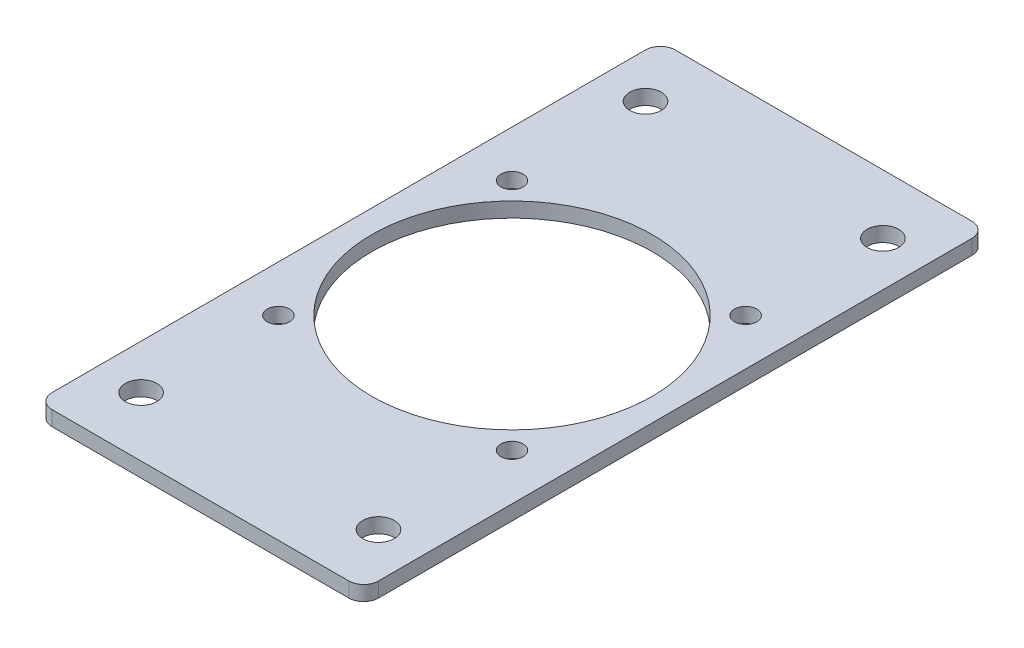
ISO-10303-21;
HEADER;
FILE_DESCRIPTION(('STEP AP214'),'2;1');
FILE_NAME('part.step','',(''),(''),'','','');
FILE_SCHEMA(('AUTOMOTIVE_DESIGN { 1 0 10303 214 1 1 1 1 }'));
ENDSEC;
DATA;
#1=APPLICATION_CONTEXT('core data for automotive mechanical design processes');
#2=APPLICATION_PROTOCOL_DEFINITION('international standard','automotive_design',2000,#1);
#3=PRODUCT_CONTEXT('',#1,'mechanical');
#4=PRODUCT('Part','Part','',(#3));
#5=PRODUCT_RELATED_PRODUCT_CATEGORY('part','',(#4));
#6=PRODUCT_DEFINITION_FORMATION('','',#4);
#7=PRODUCT_DEFINITION_CONTEXT('part definition',#1,'design');
#8=PRODUCT_DEFINITION('design','',#6,#7);
#9=PRODUCT_DEFINITION_SHAPE('','',#8);
#10=(LENGTH_UNIT() NAMED_UNIT(*) SI_UNIT(.MILLI.,.METRE.));
#11=(NAMED_UNIT(*) PLANE_ANGLE_UNIT() SI_UNIT($,.RADIAN.));
#12=(NAMED_UNIT(*) SI_UNIT($,.STERADIAN.) SOLID_ANGLE_UNIT());
#13=UNCERTAINTY_MEASURE_WITH_UNIT(LENGTH_MEASURE(1.E-05),#10,'distance_accuracy_value','');
#14=(GEOMETRIC_REPRESENTATION_CONTEXT(3) GLOBAL_UNCERTAINTY_ASSIGNED_CONTEXT((#13)) GLOBAL_UNIT_ASSIGNED_CONTEXT((#10,
#11,#12)) REPRESENTATION_CONTEXT('',''));
#15=CARTESIAN_POINT('',(0.,0.,0.));
#16=DIRECTION('',(0.,0.,1.));
#17=DIRECTION('',(1.,0.,0.));
#18=AXIS2_PLACEMENT_3D('',#15,#16,#17);
#19=CARTESIAN_POINT('',(0.,3.175,0.));
#20=DIRECTION('',(0.,-1.,0.));
#21=DIRECTION('',(0.,0.,-1.));
#22=AXIS2_PLACEMENT_3D('',#19,#20,#21);
#23=PLANE('',#22);
#24=CARTESIAN_POINT('',(25.4,3.175,53.975));
#25=DIRECTION('',(0.,1.,0.));
#26=DIRECTION('',(0.,0.,1.));
#27=AXIS2_PLACEMENT_3D('',#24,#25,#26);
#28=CIRCLE('',#27,3.3782);
#29=CARTESIAN_POINT('',(25.4,3.175,57.3532));
#30=VERTEX_POINT('',#29);
#31=EDGE_CURVE('E230',#30,#30,#28,.T.);
#32=ORIENTED_EDGE('',*,*,#31,.F.);
#33=EDGE_LOOP('',(#32));
#34=FACE_BOUND('',#33,.T.);
#35=CARTESIAN_POINT('',(25.,3.175,-25.));
#36=DIRECTION('',(0.,1.,0.));
#37=DIRECTION('',(0.,0.,1.));
#38=AXIS2_PLACEMENT_3D('',#35,#36,#37);
#39=CIRCLE('',#38,2.38125);
#40=CARTESIAN_POINT('',(25.,3.175,-22.61875));
#41=VERTEX_POINT('',#40);
#42=EDGE_CURVE('E242',#41,#41,#39,.T.);
#43=ORIENTED_EDGE('',*,*,#42,.F.);
#44=EDGE_LOOP('',(#43));
#45=FACE_BOUND('',#44,.T.);
#46=CARTESIAN_POINT('',(-25.,3.175,25.));
#47=DIRECTION('',(0.,1.,0.));
#48=DIRECTION('',(0.,0.,1.));
#49=AXIS2_PLACEMENT_3D('',#46,#47,#48);
#50=CIRCLE('',#49,2.38125);
#51=CARTESIAN_POINT('',(-25.,3.175,27.38125));
#52=VERTEX_POINT('',#51);
#53=EDGE_CURVE('E250',#52,#52,#50,.T.);
#54=ORIENTED_EDGE('',*,*,#53,.F.);
#55=EDGE_LOOP('',(#54));
#56=FACE_BOUND('',#55,.T.);
#57=CARTESIAN_POINT('',(-25.,3.175,-25.));
#58=DIRECTION('',(0.,1.,0.));
#59=DIRECTION('',(0.,0.,1.));
#60=AXIS2_PLACEMENT_3D('',#57,#58,#59);
#61=CIRCLE('',#60,2.38125);
#62=CARTESIAN_POINT('',(-25.,3.175,-22.61875));
#63=VERTEX_POINT('',#62);
#64=EDGE_CURVE('E259',#63,#63,#61,.T.);
#65=ORIENTED_EDGE('',*,*,#64,.F.);
#66=EDGE_LOOP('',(#65));
#67=FACE_BOUND('',#66,.T.);
#68=CARTESIAN_POINT('',(25.,3.175,25.));
#69=DIRECTION('',(0.,1.,0.));
#70=DIRECTION('',(0.,0.,1.));
#71=AXIS2_PLACEMENT_3D('',#68,#69,#70);
#72=CIRCLE('',#71,2.38125);
#73=CARTESIAN_POINT('',(25.,3.175,27.38125));
#74=VERTEX_POINT('',#73);
#75=EDGE_CURVE('E270',#74,#74,#72,.T.);
#76=ORIENTED_EDGE('',*,*,#75,.F.);
#77=EDGE_LOOP('',(#76));
#78=FACE_BOUND('',#77,.T.);
#79=CARTESIAN_POINT('',(0.,3.175,0.));
#80=DIRECTION('',(0.,1.,0.));
#81=DIRECTION('',(0.,0.,1.));
#82=AXIS2_PLACEMENT_3D('',#79,#80,#81);
#83=CIRCLE('',#82,30.);
#84=CARTESIAN_POINT('',(0.,3.175,30.));
#85=VERTEX_POINT('',#84);
#86=EDGE_CURVE('E146',#85,#85,#83,.T.);
#87=ORIENTED_EDGE('',*,*,#86,.F.);
#88=EDGE_LOOP('',(#87));
#89=FACE_BOUND('',#88,.T.);
#90=DIRECTION('',(1.,0.,0.));
#91=VECTOR('',#90,1.);
#92=CARTESIAN_POINT('',(-34.925,3.175,66.675));
#93=LINE('',#92,#91);
#94=CARTESIAN_POINT('',(-31.75,3.175,66.675));
#95=VERTEX_POINT('',#94);
#96=CARTESIAN_POINT('',(31.75,3.175,66.675));
#97=VERTEX_POINT('',#96);
#98=EDGE_CURVE('E149',#95,#97,#93,.T.);
#99=ORIENTED_EDGE('',*,*,#98,.T.);
#100=CARTESIAN_POINT('',(31.75,3.175,63.5));
#101=DIRECTION('',(0.,-1.,0.));
#102=DIRECTION('',(0.,0.,-1.));
#103=AXIS2_PLACEMENT_3D('',#100,#101,#102);
#104=CIRCLE('',#103,3.175);
#105=CARTESIAN_POINT('',(34.925,3.175,63.5));
#106=VERTEX_POINT('',#105);
#107=EDGE_CURVE('E180',#97,#106,#104,.F.);
#108=ORIENTED_EDGE('',*,*,#107,.T.);
#109=DIRECTION('',(0.,0.,-1.));
#110=VECTOR('',#109,1.);
#111=CARTESIAN_POINT('',(34.925,3.175,66.675));
#112=LINE('',#111,#110);
#113=CARTESIAN_POINT('',(34.925,3.175,-63.5));
#114=VERTEX_POINT('',#113);
#115=EDGE_CURVE('E129',#106,#114,#112,.T.);
#116=ORIENTED_EDGE('',*,*,#115,.T.);
#117=CARTESIAN_POINT('',(31.75,3.175,-63.5));
#118=DIRECTION('',(0.,-1.,0.));
#119=DIRECTION('',(0.,0.,-1.));
#120=AXIS2_PLACEMENT_3D('',#117,#118,#119);
#121=CIRCLE('',#120,3.175);
#122=CARTESIAN_POINT('',(31.75,3.175,-66.675));
#123=VERTEX_POINT('',#122);
#124=EDGE_CURVE('E172',#114,#123,#121,.F.);
#125=ORIENTED_EDGE('',*,*,#124,.T.);
#126=DIRECTION('',(-1.,0.,0.));
#127=VECTOR('',#126,1.);
#128=CARTESIAN_POINT('',(-34.925,3.175,-66.675));
#129=LINE('',#128,#127);
#130=CARTESIAN_POINT('',(-31.75,3.175,-66.675));
#131=VERTEX_POINT('',#130);
#132=EDGE_CURVE('E195',#123,#131,#129,.T.);
#133=ORIENTED_EDGE('',*,*,#132,.T.);
#134=CARTESIAN_POINT('',(-31.75,3.175,-63.5));
#135=DIRECTION('',(0.,-1.,0.));
#136=DIRECTION('',(0.,0.,-1.));
#137=AXIS2_PLACEMENT_3D('',#134,#135,#136);
#138=CIRCLE('',#137,3.175);
#139=CARTESIAN_POINT('',(-34.925,3.175,-63.5));
#140=VERTEX_POINT('',#139);
#141=EDGE_CURVE('E64',#131,#140,#138,.F.);
#142=ORIENTED_EDGE('',*,*,#141,.T.);
#143=DIRECTION('',(0.,0.,1.));
#144=VECTOR('',#143,1.);
#145=CARTESIAN_POINT('',(-34.925,3.175,66.675));
#146=LINE('',#145,#144);
#147=CARTESIAN_POINT('',(-34.925,3.175,63.5));
#148=VERTEX_POINT('',#147);
#149=EDGE_CURVE('E203',#140,#148,#146,.T.);
#150=ORIENTED_EDGE('',*,*,#149,.T.);
#151=CARTESIAN_POINT('',(-31.75,3.175,63.5));
#152=DIRECTION('',(0.,-1.,0.));
#153=DIRECTION('',(0.,0.,-1.));
#154=AXIS2_PLACEMENT_3D('',#151,#152,#153);
#155=CIRCLE('',#154,3.175);
#156=EDGE_CURVE('E177',#148,#95,#155,.F.);
#157=ORIENTED_EDGE('',*,*,#156,.T.);
#158=EDGE_LOOP('',(#99,#108,#116,#125,#133,#142,#150,#157));
#159=FACE_BOUND('',#158,.T.);
#160=CARTESIAN_POINT('',(-25.4,3.175,-53.975));
#161=DIRECTION('',(0.,1.,0.));
#162=DIRECTION('',(0.,0.,1.));
#163=AXIS2_PLACEMENT_3D('',#160,#161,#162);
#164=CIRCLE('',#163,3.3782);
#165=CARTESIAN_POINT('',(-25.4,3.175,-50.5968));
#166=VERTEX_POINT('',#165);
#167=EDGE_CURVE('E219',#166,#166,#164,.T.);
#168=ORIENTED_EDGE('',*,*,#167,.F.);
#169=EDGE_LOOP('',(#168));
#170=FACE_BOUND('',#169,.T.);
#171=CARTESIAN_POINT('',(-25.4,3.175,53.975));
#172=DIRECTION('',(0.,1.,0.));
#173=DIRECTION('',(0.,0.,1.));
#174=AXIS2_PLACEMENT_3D('',#171,#172,#173);
#175=CIRCLE('',#174,3.3782);
#176=CARTESIAN_POINT('',(-25.4,3.175,57.3532));
#177=VERTEX_POINT('',#176);
#178=EDGE_CURVE('E483',#177,#177,#175,.T.);
#179=ORIENTED_EDGE('',*,*,#178,.F.);
#180=EDGE_LOOP('',(#179));
#181=FACE_BOUND('',#180,.T.);
#182=CARTESIAN_POINT('',(25.4,3.175,-53.975));
#183=DIRECTION('',(0.,1.,0.));
#184=DIRECTION('',(0.,0.,1.));
#185=AXIS2_PLACEMENT_3D('',#182,#183,#184);
#186=CIRCLE('',#185,3.3782);
#187=CARTESIAN_POINT('',(25.4,3.175,-50.5968));
#188=VERTEX_POINT('',#187);
#189=EDGE_CURVE('E489',#188,#188,#186,.T.);
#190=ORIENTED_EDGE('',*,*,#189,.F.);
#191=EDGE_LOOP('',(#190));
#192=FACE_BOUND('',#191,.T.);
#193=ADVANCED_FACE('F41',(#34,#45,#56,#67,#78,#89,#159,#170,#181,#192),#23,.F.);
#194=CARTESIAN_POINT('',(34.925,3.175,66.675));
#195=DIRECTION('',(-1.,0.,0.));
#196=DIRECTION('',(0.,0.,1.));
#197=AXIS2_PLACEMENT_3D('',#194,#195,#196);
#198=PLANE('',#197);
#199=ORIENTED_EDGE('',*,*,#115,.F.);
#200=DIRECTION('',(0.,-1.,0.));
#201=VECTOR('',#200,1.);
#202=CARTESIAN_POINT('',(34.925,3.175,63.5));
#203=LINE('',#202,#201);
#204=CARTESIAN_POINT('',(34.925,0.,63.5));
#205=VERTEX_POINT('',#204);
#206=EDGE_CURVE('E112',#106,#205,#203,.T.);
#207=ORIENTED_EDGE('',*,*,#206,.T.);
#208=DIRECTION('',(0.,0.,-1.));
#209=VECTOR('',#208,1.);
#210=CARTESIAN_POINT('',(34.925,0.,66.675));
#211=LINE('',#210,#209);
#212=CARTESIAN_POINT('',(34.925,0.,-63.5));
#213=VERTEX_POINT('',#212);
#214=EDGE_CURVE('E126',#205,#213,#211,.T.);
#215=ORIENTED_EDGE('',*,*,#214,.T.);
#216=DIRECTION('',(0.,-1.,0.));
#217=VECTOR('',#216,1.);
#218=CARTESIAN_POINT('',(34.925,3.175,-63.5));
#219=LINE('',#218,#217);
#220=EDGE_CURVE('E132',#213,#114,#219,.F.);
#221=ORIENTED_EDGE('',*,*,#220,.T.);
#222=EDGE_LOOP('',(#199,#207,#215,#221));
#223=FACE_BOUND('',#222,.T.);
#224=ADVANCED_FACE('F125',(#223),#198,.F.);
#225=CARTESIAN_POINT('',(-34.925,3.175,-66.675));
#226=DIRECTION('',(0.,0.,1.));
#227=DIRECTION('',(1.,0.,0.));
#228=AXIS2_PLACEMENT_3D('',#225,#226,#227);
#229=PLANE('',#228);
#230=DIRECTION('',(-1.,0.,0.));
#231=VECTOR('',#230,1.);
#232=CARTESIAN_POINT('',(-34.925,0.,-66.675));
#233=LINE('',#232,#231);
#234=CARTESIAN_POINT('',(31.75,0.,-66.675));
#235=VERTEX_POINT('',#234);
#236=CARTESIAN_POINT('',(-31.75,0.,-66.675));
#237=VERTEX_POINT('',#236);
#238=EDGE_CURVE('E137',#235,#237,#233,.T.);
#239=ORIENTED_EDGE('',*,*,#238,.T.);
#240=DIRECTION('',(0.,-1.,0.));
#241=VECTOR('',#240,1.);
#242=CARTESIAN_POINT('',(-31.75,3.175,-66.675));
#243=LINE('',#242,#241);
#244=EDGE_CURVE('E12',#237,#131,#243,.F.);
#245=ORIENTED_EDGE('',*,*,#244,.T.);
#246=ORIENTED_EDGE('',*,*,#132,.F.);
#247=DIRECTION('',(0.,-1.,0.));
#248=VECTOR('',#247,1.);
#249=CARTESIAN_POINT('',(31.75,3.175,-66.675));
#250=LINE('',#249,#248);
#251=EDGE_CURVE('E50',#123,#235,#250,.T.);
#252=ORIENTED_EDGE('',*,*,#251,.T.);
#253=EDGE_LOOP('',(#239,#245,#246,#252));
#254=FACE_BOUND('',#253,.T.);
#255=ADVANCED_FACE('F193',(#254),#229,.F.);
#256=CARTESIAN_POINT('',(-34.925,3.175,66.675));
#257=DIRECTION('',(1.,0.,0.));
#258=DIRECTION('',(0.,0.,-1.));
#259=AXIS2_PLACEMENT_3D('',#256,#257,#258);
#260=PLANE('',#259);
#261=DIRECTION('',(0.,0.,1.));
#262=VECTOR('',#261,1.);
#263=CARTESIAN_POINT('',(-34.925,0.,66.675));
#264=LINE('',#263,#262);
#265=CARTESIAN_POINT('',(-34.925,0.,-63.5));
#266=VERTEX_POINT('',#265);
#267=CARTESIAN_POINT('',(-34.925,0.,63.5));
#268=VERTEX_POINT('',#267);
#269=EDGE_CURVE('E143',#266,#268,#264,.T.);
#270=ORIENTED_EDGE('',*,*,#269,.T.);
#271=DIRECTION('',(0.,-1.,0.));
#272=VECTOR('',#271,1.);
#273=CARTESIAN_POINT('',(-34.925,3.175,63.5));
#274=LINE('',#273,#272);
#275=EDGE_CURVE('E57',#268,#148,#274,.F.);
#276=ORIENTED_EDGE('',*,*,#275,.T.);
#277=ORIENTED_EDGE('',*,*,#149,.F.);
#278=DIRECTION('',(0.,-1.,0.));
#279=VECTOR('',#278,1.);
#280=CARTESIAN_POINT('',(-34.925,3.175,-63.5));
#281=LINE('',#280,#279);
#282=EDGE_CURVE('E183',#140,#266,#281,.T.);
#283=ORIENTED_EDGE('',*,*,#282,.T.);
#284=EDGE_LOOP('',(#270,#276,#277,#283));
#285=FACE_BOUND('',#284,.T.);
#286=ADVANCED_FACE('F202',(#285),#260,.F.);
#287=CARTESIAN_POINT('',(-34.925,3.175,66.675));
#288=DIRECTION('',(0.,0.,-1.));
#289=DIRECTION('',(-1.,0.,0.));
#290=AXIS2_PLACEMENT_3D('',#287,#288,#289);
#291=PLANE('',#290);
#292=DIRECTION('',(1.,0.,0.));
#293=VECTOR('',#292,1.);
#294=CARTESIAN_POINT('',(-34.925,0.,66.675));
#295=LINE('',#294,#293);
#296=CARTESIAN_POINT('',(-31.75,0.,66.675));
#297=VERTEX_POINT('',#296);
#298=CARTESIAN_POINT('',(31.75,0.,66.675));
#299=VERTEX_POINT('',#298);
#300=EDGE_CURVE('E155',#297,#299,#295,.T.);
#301=ORIENTED_EDGE('',*,*,#300,.T.);
#302=DIRECTION('',(0.,-1.,0.));
#303=VECTOR('',#302,1.);
#304=CARTESIAN_POINT('',(31.75,3.175,66.675));
#305=LINE('',#304,#303);
#306=EDGE_CURVE('E113',#299,#97,#305,.F.);
#307=ORIENTED_EDGE('',*,*,#306,.T.);
#308=ORIENTED_EDGE('',*,*,#98,.F.);
#309=DIRECTION('',(0.,-1.,0.));
#310=VECTOR('',#309,1.);
#311=CARTESIAN_POINT('',(-31.75,3.175,66.675));
#312=LINE('',#311,#310);
#313=EDGE_CURVE('E119',#95,#297,#312,.T.);
#314=ORIENTED_EDGE('',*,*,#313,.T.);
#315=EDGE_LOOP('',(#301,#307,#308,#314));
#316=FACE_BOUND('',#315,.T.);
#317=ADVANCED_FACE('F304',(#316),#291,.F.);
#318=CARTESIAN_POINT('',(0.,0.,0.));
#319=DIRECTION('',(0.,-1.,0.));
#320=DIRECTION('',(0.,0.,-1.));
#321=AXIS2_PLACEMENT_3D('',#318,#319,#320);
#322=PLANE('',#321);
#323=CARTESIAN_POINT('',(25.4,0.,-53.975));
#324=DIRECTION('',(0.,-1.,0.));
#325=DIRECTION('',(0.,0.,-1.));
#326=AXIS2_PLACEMENT_3D('',#323,#324,#325);
#327=CIRCLE('',#326,3.3782);
#328=CARTESIAN_POINT('',(25.4,0.,-57.3532));
#329=VERTEX_POINT('',#328);
#330=EDGE_CURVE('E486',#329,#329,#327,.T.);
#331=ORIENTED_EDGE('',*,*,#330,.F.);
#332=EDGE_LOOP('',(#331));
#333=FACE_BOUND('',#332,.T.);
#334=CARTESIAN_POINT('',(-25.4,0.,53.975));
#335=DIRECTION('',(0.,-1.,0.));
#336=DIRECTION('',(0.,0.,-1.));
#337=AXIS2_PLACEMENT_3D('',#334,#335,#336);
#338=CIRCLE('',#337,3.3782);
#339=CARTESIAN_POINT('',(-25.4,0.,50.5968));
#340=VERTEX_POINT('',#339);
#341=EDGE_CURVE('E226',#340,#340,#338,.T.);
#342=ORIENTED_EDGE('',*,*,#341,.F.);
#343=EDGE_LOOP('',(#342));
#344=FACE_BOUND('',#343,.T.);
#345=CARTESIAN_POINT('',(-25.4,0.,-53.975));
#346=DIRECTION('',(0.,-1.,0.));
#347=DIRECTION('',(0.,0.,-1.));
#348=AXIS2_PLACEMENT_3D('',#345,#346,#347);
#349=CIRCLE('',#348,3.3782);
#350=CARTESIAN_POINT('',(-25.4,0.,-57.3532));
#351=VERTEX_POINT('',#350);
#352=EDGE_CURVE('E225',#351,#351,#349,.T.);
#353=ORIENTED_EDGE('',*,*,#352,.F.);
#354=EDGE_LOOP('',(#353));
#355=FACE_BOUND('',#354,.T.);
#356=CARTESIAN_POINT('',(25.4,0.,53.975));
#357=DIRECTION('',(0.,-1.,0.));
#358=DIRECTION('',(0.,0.,-1.));
#359=AXIS2_PLACEMENT_3D('',#356,#357,#358);
#360=CIRCLE('',#359,3.3782);
#361=CARTESIAN_POINT('',(25.4,0.,50.5968));
#362=VERTEX_POINT('',#361);
#363=EDGE_CURVE('E235',#362,#362,#360,.T.);
#364=ORIENTED_EDGE('',*,*,#363,.F.);
#365=EDGE_LOOP('',(#364));
#366=FACE_BOUND('',#365,.T.);
#367=CARTESIAN_POINT('',(25.,0.,-25.));
#368=DIRECTION('',(0.,-1.,0.));
#369=DIRECTION('',(0.,0.,-1.));
#370=AXIS2_PLACEMENT_3D('',#367,#368,#369);
#371=CIRCLE('',#370,2.38125);
#372=CARTESIAN_POINT('',(25.,0.,-27.38125));
#373=VERTEX_POINT('',#372);
#374=EDGE_CURVE('E247',#373,#373,#371,.T.);
#375=ORIENTED_EDGE('',*,*,#374,.F.);
#376=EDGE_LOOP('',(#375));
#377=FACE_BOUND('',#376,.T.);
#378=CARTESIAN_POINT('',(-25.,0.,25.));
#379=DIRECTION('',(0.,-1.,0.));
#380=DIRECTION('',(0.,0.,-1.));
#381=AXIS2_PLACEMENT_3D('',#378,#379,#380);
#382=CIRCLE('',#381,2.38125);
#383=CARTESIAN_POINT('',(-25.,0.,22.61875));
#384=VERTEX_POINT('',#383);
#385=EDGE_CURVE('E255',#384,#384,#382,.T.);
#386=ORIENTED_EDGE('',*,*,#385,.F.);
#387=EDGE_LOOP('',(#386));
#388=FACE_BOUND('',#387,.T.);
#389=CARTESIAN_POINT('',(-25.,0.,-25.));
#390=DIRECTION('',(0.,-1.,0.));
#391=DIRECTION('',(0.,0.,-1.));
#392=AXIS2_PLACEMENT_3D('',#389,#390,#391);
#393=CIRCLE('',#392,2.38125);
#394=CARTESIAN_POINT('',(-25.,0.,-27.38125));
#395=VERTEX_POINT('',#394);
#396=EDGE_CURVE('E264',#395,#395,#393,.T.);
#397=ORIENTED_EDGE('',*,*,#396,.F.);
#398=EDGE_LOOP('',(#397));
#399=FACE_BOUND('',#398,.T.);
#400=CARTESIAN_POINT('',(25.,0.,25.));
#401=DIRECTION('',(0.,-1.,0.));
#402=DIRECTION('',(0.,0.,-1.));
#403=AXIS2_PLACEMENT_3D('',#400,#401,#402);
#404=CIRCLE('',#403,2.38125);
#405=CARTESIAN_POINT('',(25.,0.,22.61875));
#406=VERTEX_POINT('',#405);
#407=EDGE_CURVE('E275',#406,#406,#404,.T.);
#408=ORIENTED_EDGE('',*,*,#407,.F.);
#409=EDGE_LOOP('',(#408));
#410=FACE_BOUND('',#409,.T.);
#411=CARTESIAN_POINT('',(0.,0.,0.));
#412=DIRECTION('',(0.,1.,0.));
#413=DIRECTION('',(0.,0.,1.));
#414=AXIS2_PLACEMENT_3D('',#411,#412,#413);
#415=CIRCLE('',#414,30.);
#416=CARTESIAN_POINT('',(0.,0.,30.));
#417=VERTEX_POINT('',#416);
#418=EDGE_CURVE('E138',#417,#417,#415,.T.);
#419=ORIENTED_EDGE('',*,*,#418,.T.);
#420=EDGE_LOOP('',(#419));
#421=FACE_BOUND('',#420,.T.);
#422=ORIENTED_EDGE('',*,*,#214,.F.);
#423=CARTESIAN_POINT('',(31.75,0.,63.5));
#424=DIRECTION('',(0.,-1.,0.));
#425=DIRECTION('',(0.,0.,-1.));
#426=AXIS2_PLACEMENT_3D('',#423,#424,#425);
#427=CIRCLE('',#426,3.175);
#428=EDGE_CURVE('E108',#205,#299,#427,.T.);
#429=ORIENTED_EDGE('',*,*,#428,.T.);
#430=ORIENTED_EDGE('',*,*,#300,.F.);
#431=CARTESIAN_POINT('',(-31.75,0.,63.5));
#432=DIRECTION('',(0.,-1.,0.));
#433=DIRECTION('',(0.,0.,-1.));
#434=AXIS2_PLACEMENT_3D('',#431,#432,#433);
#435=CIRCLE('',#434,3.175);
#436=EDGE_CURVE('E120',#297,#268,#435,.T.);
#437=ORIENTED_EDGE('',*,*,#436,.T.);
#438=ORIENTED_EDGE('',*,*,#269,.F.);
#439=CARTESIAN_POINT('',(-31.75,0.,-63.5));
#440=DIRECTION('',(0.,-1.,0.));
#441=DIRECTION('',(0.,0.,-1.));
#442=AXIS2_PLACEMENT_3D('',#439,#440,#441);
#443=CIRCLE('',#442,3.175);
#444=EDGE_CURVE('E162',#266,#237,#443,.T.);
#445=ORIENTED_EDGE('',*,*,#444,.T.);
#446=ORIENTED_EDGE('',*,*,#238,.F.);
#447=CARTESIAN_POINT('',(31.75,0.,-63.5));
#448=DIRECTION('',(0.,-1.,0.));
#449=DIRECTION('',(0.,0.,-1.));
#450=AXIS2_PLACEMENT_3D('',#447,#448,#449);
#451=CIRCLE('',#450,3.175);
#452=EDGE_CURVE('E131',#235,#213,#451,.T.);
#453=ORIENTED_EDGE('',*,*,#452,.T.);
#454=EDGE_LOOP('',(#422,#429,#430,#437,#438,#445,#446,#453));
#455=FACE_BOUND('',#454,.T.);
#456=ADVANCED_FACE('F134',(#333,#344,#355,#366,#377,#388,#399,#410,#421,#455),#322,.T.);
#457=CARTESIAN_POINT('',(0.,0.,0.));
#458=DIRECTION('',(0.,1.,0.));
#459=DIRECTION('',(0.,0.,1.));
#460=AXIS2_PLACEMENT_3D('',#457,#458,#459);
#461=CYLINDRICAL_SURFACE('',#460,30.);
#462=ORIENTED_EDGE('',*,*,#418,.F.);
#463=EDGE_LOOP('',(#462));
#464=FACE_BOUND('',#463,.T.);
#465=ORIENTED_EDGE('',*,*,#86,.T.);
#466=EDGE_LOOP('',(#465));
#467=FACE_BOUND('',#466,.T.);
#468=ADVANCED_FACE('F300',(#464,#467),#461,.F.);
#469=CARTESIAN_POINT('',(25.,3.175,25.));
#470=DIRECTION('',(0.,1.,0.));
#471=DIRECTION('',(0.,0.,1.));
#472=AXIS2_PLACEMENT_3D('',#469,#470,#471);
#473=CYLINDRICAL_SURFACE('',#472,2.38125);
#474=ORIENTED_EDGE('',*,*,#75,.T.);
#475=EDGE_LOOP('',(#474));
#476=FACE_BOUND('',#475,.T.);
#477=ORIENTED_EDGE('',*,*,#407,.T.);
#478=EDGE_LOOP('',(#477));
#479=FACE_BOUND('',#478,.T.);
#480=ADVANCED_FACE('F408',(#476,#479),#473,.F.);
#481=CARTESIAN_POINT('',(-25.,3.175,-25.));
#482=DIRECTION('',(0.,1.,0.));
#483=DIRECTION('',(0.,0.,1.));
#484=AXIS2_PLACEMENT_3D('',#481,#482,#483);
#485=CYLINDRICAL_SURFACE('',#484,2.38125);
#486=ORIENTED_EDGE('',*,*,#64,.T.);
#487=EDGE_LOOP('',(#486));
#488=FACE_BOUND('',#487,.T.);
#489=ORIENTED_EDGE('',*,*,#396,.T.);
#490=EDGE_LOOP('',(#489));
#491=FACE_BOUND('',#490,.T.);
#492=ADVANCED_FACE('F399',(#488,#491),#485,.F.);
#493=CARTESIAN_POINT('',(-25.,3.175,25.));
#494=DIRECTION('',(0.,1.,0.));
#495=DIRECTION('',(0.,0.,1.));
#496=AXIS2_PLACEMENT_3D('',#493,#494,#495);
#497=CYLINDRICAL_SURFACE('',#496,2.38125);
#498=ORIENTED_EDGE('',*,*,#53,.T.);
#499=EDGE_LOOP('',(#498));
#500=FACE_BOUND('',#499,.T.);
#501=ORIENTED_EDGE('',*,*,#385,.T.);
#502=EDGE_LOOP('',(#501));
#503=FACE_BOUND('',#502,.T.);
#504=ADVANCED_FACE('F390',(#500,#503),#497,.F.);
#505=CARTESIAN_POINT('',(25.,3.175,-25.));
#506=DIRECTION('',(0.,1.,0.));
#507=DIRECTION('',(0.,0.,1.));
#508=AXIS2_PLACEMENT_3D('',#505,#506,#507);
#509=CYLINDRICAL_SURFACE('',#508,2.38125);
#510=ORIENTED_EDGE('',*,*,#42,.T.);
#511=EDGE_LOOP('',(#510));
#512=FACE_BOUND('',#511,.T.);
#513=ORIENTED_EDGE('',*,*,#374,.T.);
#514=EDGE_LOOP('',(#513));
#515=FACE_BOUND('',#514,.T.);
#516=ADVANCED_FACE('F376',(#512,#515),#509,.F.);
#517=CARTESIAN_POINT('',(25.4,3.175,53.975));
#518=DIRECTION('',(0.,1.,0.));
#519=DIRECTION('',(0.,0.,1.));
#520=AXIS2_PLACEMENT_3D('',#517,#518,#519);
#521=CYLINDRICAL_SURFACE('',#520,3.3782);
#522=ORIENTED_EDGE('',*,*,#31,.T.);
#523=EDGE_LOOP('',(#522));
#524=FACE_BOUND('',#523,.T.);
#525=ORIENTED_EDGE('',*,*,#363,.T.);
#526=EDGE_LOOP('',(#525));
#527=FACE_BOUND('',#526,.T.);
#528=ADVANCED_FACE('F367',(#524,#527),#521,.F.);
#529=CARTESIAN_POINT('',(-25.4,3.175,-53.975));
#530=DIRECTION('',(0.,1.,0.));
#531=DIRECTION('',(0.,0.,1.));
#532=AXIS2_PLACEMENT_3D('',#529,#530,#531);
#533=CYLINDRICAL_SURFACE('',#532,3.3782);
#534=ORIENTED_EDGE('',*,*,#167,.T.);
#535=EDGE_LOOP('',(#534));
#536=FACE_BOUND('',#535,.T.);
#537=ORIENTED_EDGE('',*,*,#352,.T.);
#538=EDGE_LOOP('',(#537));
#539=FACE_BOUND('',#538,.T.);
#540=ADVANCED_FACE('F358',(#536,#539),#533,.F.);
#541=CARTESIAN_POINT('',(-25.4,3.175,53.975));
#542=DIRECTION('',(0.,1.,0.));
#543=DIRECTION('',(0.,0.,1.));
#544=AXIS2_PLACEMENT_3D('',#541,#542,#543);
#545=CYLINDRICAL_SURFACE('',#544,3.3782);
#546=ORIENTED_EDGE('',*,*,#178,.T.);
#547=EDGE_LOOP('',(#546));
#548=FACE_BOUND('',#547,.T.);
#549=ORIENTED_EDGE('',*,*,#341,.T.);
#550=EDGE_LOOP('',(#549));
#551=FACE_BOUND('',#550,.T.);
#552=ADVANCED_FACE('F349',(#548,#551),#545,.F.);
#553=CARTESIAN_POINT('',(25.4,3.175,-53.975));
#554=DIRECTION('',(0.,1.,0.));
#555=DIRECTION('',(0.,0.,1.));
#556=AXIS2_PLACEMENT_3D('',#553,#554,#555);
#557=CYLINDRICAL_SURFACE('',#556,3.3782);
#558=ORIENTED_EDGE('',*,*,#189,.T.);
#559=EDGE_LOOP('',(#558));
#560=FACE_BOUND('',#559,.T.);
#561=ORIENTED_EDGE('',*,*,#330,.T.);
#562=EDGE_LOOP('',(#561));
#563=FACE_BOUND('',#562,.T.);
#564=ADVANCED_FACE('F315',(#560,#563),#557,.F.);
#565=CARTESIAN_POINT('',(31.75,3.175,63.5));
#566=DIRECTION('',(0.,-1.,0.));
#567=DIRECTION('',(0.,0.,-1.));
#568=AXIS2_PLACEMENT_3D('',#565,#566,#567);
#569=CYLINDRICAL_SURFACE('',#568,3.175);
#570=ORIENTED_EDGE('',*,*,#107,.F.);
#571=ORIENTED_EDGE('',*,*,#306,.F.);
#572=ORIENTED_EDGE('',*,*,#428,.F.);
#573=ORIENTED_EDGE('',*,*,#206,.F.);
#574=EDGE_LOOP('',(#570,#571,#572,#573));
#575=FACE_BOUND('',#574,.T.);
#576=ADVANCED_FACE('F111',(#575),#569,.T.);
#577=CARTESIAN_POINT('',(-31.75,3.175,63.5));
#578=DIRECTION('',(0.,-1.,0.));
#579=DIRECTION('',(0.,0.,-1.));
#580=AXIS2_PLACEMENT_3D('',#577,#578,#579);
#581=CYLINDRICAL_SURFACE('',#580,3.175);
#582=ORIENTED_EDGE('',*,*,#156,.F.);
#583=ORIENTED_EDGE('',*,*,#275,.F.);
#584=ORIENTED_EDGE('',*,*,#436,.F.);
#585=ORIENTED_EDGE('',*,*,#313,.F.);
#586=EDGE_LOOP('',(#582,#583,#584,#585));
#587=FACE_BOUND('',#586,.T.);
#588=ADVANCED_FACE('F288',(#587),#581,.T.);
#589=CARTESIAN_POINT('',(-31.75,3.175,-63.5));
#590=DIRECTION('',(0.,-1.,0.));
#591=DIRECTION('',(0.,0.,-1.));
#592=AXIS2_PLACEMENT_3D('',#589,#590,#591);
#593=CYLINDRICAL_SURFACE('',#592,3.175);
#594=ORIENTED_EDGE('',*,*,#141,.F.);
#595=ORIENTED_EDGE('',*,*,#244,.F.);
#596=ORIENTED_EDGE('',*,*,#444,.F.);
#597=ORIENTED_EDGE('',*,*,#282,.F.);
#598=EDGE_LOOP('',(#594,#595,#596,#597));
#599=FACE_BOUND('',#598,.T.);
#600=ADVANCED_FACE('F201',(#599),#593,.T.);
#601=CARTESIAN_POINT('',(31.75,3.175,-63.5));
#602=DIRECTION('',(0.,-1.,0.));
#603=DIRECTION('',(0.,0.,-1.));
#604=AXIS2_PLACEMENT_3D('',#601,#602,#603);
#605=CYLINDRICAL_SURFACE('',#604,3.175);
#606=ORIENTED_EDGE('',*,*,#124,.F.);
#607=ORIENTED_EDGE('',*,*,#220,.F.);
#608=ORIENTED_EDGE('',*,*,#452,.F.);
#609=ORIENTED_EDGE('',*,*,#251,.F.);
#610=EDGE_LOOP('',(#606,#607,#608,#609));
#611=FACE_BOUND('',#610,.T.);
#612=ADVANCED_FACE('F43',(#611),#605,.T.);
#613=CLOSED_SHELL('',(#193,#224,#255,#286,#317,#456,#468,#480,#492,#504,#516,#528,#540,#552,
#564,#576,#588,#600,#612));
#614=MANIFOLD_SOLID_BREP('B2',#613);
#615=ADVANCED_BREP_SHAPE_REPRESENTATION('',(#18,#614),#14);
#616=SHAPE_DEFINITION_REPRESENTATION(#9,#615);
ENDSEC;
END-ISO-10303-21;
